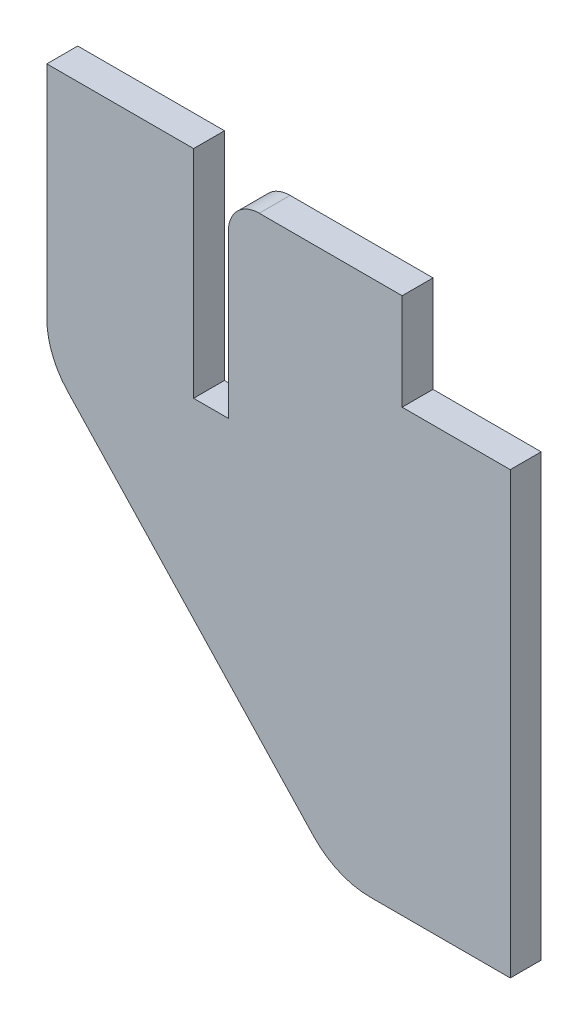
ISO-10303-21;
HEADER;
FILE_DESCRIPTION(('STEP AP214'),'2;1');
FILE_NAME('part.step','',(''),(''),'','','');
FILE_SCHEMA(('AUTOMOTIVE_DESIGN { 1 0 10303 214 1 1 1 1 }'));
ENDSEC;
DATA;
#1=APPLICATION_CONTEXT('core data for automotive mechanical design processes');
#2=APPLICATION_PROTOCOL_DEFINITION('international standard','automotive_design',2000,#1);
#3=PRODUCT_CONTEXT('',#1,'mechanical');
#4=PRODUCT('Part','Part','',(#3));
#5=PRODUCT_RELATED_PRODUCT_CATEGORY('part','',(#4));
#6=PRODUCT_DEFINITION_FORMATION('','',#4);
#7=PRODUCT_DEFINITION_CONTEXT('part definition',#1,'design');
#8=PRODUCT_DEFINITION('design','',#6,#7);
#9=PRODUCT_DEFINITION_SHAPE('','',#8);
#10=(LENGTH_UNIT() NAMED_UNIT(*) SI_UNIT(.MILLI.,.METRE.));
#11=(NAMED_UNIT(*) PLANE_ANGLE_UNIT() SI_UNIT($,.RADIAN.));
#12=(NAMED_UNIT(*) SI_UNIT($,.STERADIAN.) SOLID_ANGLE_UNIT());
#13=UNCERTAINTY_MEASURE_WITH_UNIT(LENGTH_MEASURE(1.E-05),#10,'distance_accuracy_value','');
#14=(GEOMETRIC_REPRESENTATION_CONTEXT(3) GLOBAL_UNCERTAINTY_ASSIGNED_CONTEXT((#13)) GLOBAL_UNIT_ASSIGNED_CONTEXT((#10,
#11,#12)) REPRESENTATION_CONTEXT('',''));
#15=CARTESIAN_POINT('',(0.,0.,0.));
#16=DIRECTION('',(0.,0.,1.));
#17=DIRECTION('',(1.,0.,0.));
#18=AXIS2_PLACEMENT_3D('',#15,#16,#17);
#19=CARTESIAN_POINT('',(0.,0.,8.));
#20=DIRECTION('',(0.,1.,0.));
#21=DIRECTION('',(-1.,0.,0.));
#22=AXIS2_PLACEMENT_3D('',#19,#20,#21);
#23=PLANE('',#22);
#24=DIRECTION('',(1.,0.,0.));
#25=VECTOR('',#24,1.);
#26=CARTESIAN_POINT('',(0.,0.,8.));
#27=LINE('',#26,#25);
#28=CARTESIAN_POINT('',(-36.3353597506733,0.,8.));
#29=VERTEX_POINT('',#28);
#30=CARTESIAN_POINT('',(0.,0.,8.));
#31=VERTEX_POINT('',#30);
#32=EDGE_CURVE('E138',#29,#31,#27,.T.);
#33=ORIENTED_EDGE('',*,*,#32,.F.);
#34=DIRECTION('',(0.,0.,-1.));
#35=VECTOR('',#34,1.);
#36=CARTESIAN_POINT('',(-36.3353597506734,0.,8.));
#37=LINE('',#36,#35);
#38=CARTESIAN_POINT('',(-36.3353597506733,0.,0.));
#39=VERTEX_POINT('',#38);
#40=EDGE_CURVE('E162',#29,#39,#37,.T.);
#41=ORIENTED_EDGE('',*,*,#40,.T.);
#42=DIRECTION('',(1.,0.,0.));
#43=VECTOR('',#42,1.);
#44=CARTESIAN_POINT('',(0.,0.,0.));
#45=LINE('',#44,#43);
#46=CARTESIAN_POINT('',(0.,0.,0.));
#47=VERTEX_POINT('',#46);
#48=EDGE_CURVE('E160',#39,#47,#45,.T.);
#49=ORIENTED_EDGE('',*,*,#48,.T.);
#50=DIRECTION('',(0.,0.,-1.));
#51=VECTOR('',#50,1.);
#52=CARTESIAN_POINT('',(0.,0.,8.));
#53=LINE('',#52,#51);
#54=EDGE_CURVE('E153',#31,#47,#53,.T.);
#55=ORIENTED_EDGE('',*,*,#54,.F.);
#56=EDGE_LOOP('',(#33,#41,#49,#55));
#57=FACE_BOUND('',#56,.T.);
#58=ADVANCED_FACE('F36',(#57),#23,.F.);
#59=CARTESIAN_POINT('',(0.,0.,8.));
#60=DIRECTION('',(-1.,0.,0.));
#61=DIRECTION('',(0.,0.,1.));
#62=AXIS2_PLACEMENT_3D('',#59,#60,#61);
#63=PLANE('',#62);
#64=DIRECTION('',(0.,1.,0.));
#65=VECTOR('',#64,1.);
#66=CARTESIAN_POINT('',(0.,0.,0.));
#67=LINE('',#66,#65);
#68=CARTESIAN_POINT('',(0.,114.,0.));
#69=VERTEX_POINT('',#68);
#70=EDGE_CURVE('E238',#47,#69,#67,.T.);
#71=ORIENTED_EDGE('',*,*,#70,.T.);
#72=DIRECTION('',(0.,0.,-1.));
#73=VECTOR('',#72,1.);
#74=CARTESIAN_POINT('',(0.,114.,8.));
#75=LINE('',#74,#73);
#76=CARTESIAN_POINT('',(0.,114.,8.));
#77=VERTEX_POINT('',#76);
#78=EDGE_CURVE('E155',#77,#69,#75,.T.);
#79=ORIENTED_EDGE('',*,*,#78,.F.);
#80=DIRECTION('',(0.,1.,0.));
#81=VECTOR('',#80,1.);
#82=CARTESIAN_POINT('',(0.,0.,8.));
#83=LINE('',#82,#81);
#84=EDGE_CURVE('E141',#31,#77,#83,.T.);
#85=ORIENTED_EDGE('',*,*,#84,.F.);
#86=ORIENTED_EDGE('',*,*,#54,.T.);
#87=EDGE_LOOP('',(#71,#79,#85,#86));
#88=FACE_BOUND('',#87,.T.);
#89=ADVANCED_FACE('F152',(#88),#63,.F.);
#90=CARTESIAN_POINT('',(-28.,114.,8.));
#91=DIRECTION('',(0.,-1.,0.));
#92=DIRECTION('',(0.,0.,-1.));
#93=AXIS2_PLACEMENT_3D('',#90,#91,#92);
#94=PLANE('',#93);
#95=DIRECTION('',(-1.,0.,0.));
#96=VECTOR('',#95,1.);
#97=CARTESIAN_POINT('',(-28.,114.,0.));
#98=LINE('',#97,#96);
#99=CARTESIAN_POINT('',(-28.,114.,0.));
#100=VERTEX_POINT('',#99);
#101=EDGE_CURVE('E232',#69,#100,#98,.T.);
#102=ORIENTED_EDGE('',*,*,#101,.T.);
#103=DIRECTION('',(0.,0.,-1.));
#104=VECTOR('',#103,1.);
#105=CARTESIAN_POINT('',(-28.,114.,8.));
#106=LINE('',#105,#104);
#107=CARTESIAN_POINT('',(-28.,114.,8.));
#108=VERTEX_POINT('',#107);
#109=EDGE_CURVE('E166',#108,#100,#106,.T.);
#110=ORIENTED_EDGE('',*,*,#109,.F.);
#111=DIRECTION('',(-1.,0.,0.));
#112=VECTOR('',#111,1.);
#113=CARTESIAN_POINT('',(-28.,114.,8.));
#114=LINE('',#113,#112);
#115=EDGE_CURVE('E157',#77,#108,#114,.T.);
#116=ORIENTED_EDGE('',*,*,#115,.F.);
#117=ORIENTED_EDGE('',*,*,#78,.T.);
#118=EDGE_LOOP('',(#102,#110,#116,#117));
#119=FACE_BOUND('',#118,.T.);
#120=ADVANCED_FACE('F264',(#119),#94,.F.);
#121=CARTESIAN_POINT('',(-28.,139.,8.));
#122=DIRECTION('',(-1.,0.,0.));
#123=DIRECTION('',(0.,-1.,0.));
#124=AXIS2_PLACEMENT_3D('',#121,#122,#123);
#125=PLANE('',#124);
#126=DIRECTION('',(0.,1.,0.));
#127=VECTOR('',#126,1.);
#128=CARTESIAN_POINT('',(-28.,139.,0.));
#129=LINE('',#128,#127);
#130=CARTESIAN_POINT('',(-28.,139.,0.));
#131=VERTEX_POINT('',#130);
#132=EDGE_CURVE('E227',#100,#131,#129,.T.);
#133=ORIENTED_EDGE('',*,*,#132,.T.);
#134=DIRECTION('',(0.,0.,-1.));
#135=VECTOR('',#134,1.);
#136=CARTESIAN_POINT('',(-28.,139.,8.));
#137=LINE('',#136,#135);
#138=CARTESIAN_POINT('',(-28.,139.,8.));
#139=VERTEX_POINT('',#138);
#140=EDGE_CURVE('E218',#139,#131,#137,.T.);
#141=ORIENTED_EDGE('',*,*,#140,.F.);
#142=DIRECTION('',(0.,1.,0.));
#143=VECTOR('',#142,1.);
#144=CARTESIAN_POINT('',(-28.,139.,8.));
#145=LINE('',#144,#143);
#146=EDGE_CURVE('E228',#108,#139,#145,.T.);
#147=ORIENTED_EDGE('',*,*,#146,.F.);
#148=ORIENTED_EDGE('',*,*,#109,.T.);
#149=EDGE_LOOP('',(#133,#141,#147,#148));
#150=FACE_BOUND('',#149,.T.);
#151=ADVANCED_FACE('F225',(#150),#125,.F.);
#152=CARTESIAN_POINT('',(-65.,139.,8.));
#153=DIRECTION('',(0.,-1.,0.));
#154=DIRECTION('',(0.,0.,-1.));
#155=AXIS2_PLACEMENT_3D('',#152,#153,#154);
#156=PLANE('',#155);
#157=DIRECTION('',(-1.,0.,0.));
#158=VECTOR('',#157,1.);
#159=CARTESIAN_POINT('',(-65.,139.,0.));
#160=LINE('',#159,#158);
#161=CARTESIAN_POINT('',(-65.,139.,0.));
#162=VERTEX_POINT('',#161);
#163=EDGE_CURVE('E234',#131,#162,#160,.T.);
#164=ORIENTED_EDGE('',*,*,#163,.T.);
#165=DIRECTION('',(0.,0.,-1.));
#166=VECTOR('',#165,1.);
#167=CARTESIAN_POINT('',(-65.,139.,8.));
#168=LINE('',#167,#166);
#169=CARTESIAN_POINT('',(-65.,139.,8.));
#170=VERTEX_POINT('',#169);
#171=EDGE_CURVE('E215',#170,#162,#168,.T.);
#172=ORIENTED_EDGE('',*,*,#171,.F.);
#173=DIRECTION('',(-1.,0.,0.));
#174=VECTOR('',#173,1.);
#175=CARTESIAN_POINT('',(-65.,139.,8.));
#176=LINE('',#175,#174);
#177=EDGE_CURVE('E266',#139,#170,#176,.T.);
#178=ORIENTED_EDGE('',*,*,#177,.F.);
#179=ORIENTED_EDGE('',*,*,#140,.T.);
#180=EDGE_LOOP('',(#164,#172,#178,#179));
#181=FACE_BOUND('',#180,.T.);
#182=ADVANCED_FACE('F288',(#181),#156,.F.);
#183=CARTESIAN_POINT('',(-65.,131.,8.));
#184=DIRECTION('',(0.,0.,-1.));
#185=DIRECTION('',(-1.,0.,0.));
#186=AXIS2_PLACEMENT_3D('',#183,#184,#185);
#187=CYLINDRICAL_SURFACE('',#186,8.00000000000001);
#188=CARTESIAN_POINT('',(-65.,131.,0.));
#189=DIRECTION('',(0.,0.,1.));
#190=DIRECTION('',(1.,0.,0.));
#191=AXIS2_PLACEMENT_3D('',#188,#189,#190);
#192=CIRCLE('',#191,8.00000000000001);
#193=CARTESIAN_POINT('',(-73.,131.,0.));
#194=VERTEX_POINT('',#193);
#195=EDGE_CURVE('E236',#162,#194,#192,.T.);
#196=ORIENTED_EDGE('',*,*,#195,.T.);
#197=DIRECTION('',(0.,0.,-1.));
#198=VECTOR('',#197,1.);
#199=CARTESIAN_POINT('',(-73.,131.,8.));
#200=LINE('',#199,#198);
#201=CARTESIAN_POINT('',(-73.,131.,8.));
#202=VERTEX_POINT('',#201);
#203=EDGE_CURVE('E212',#202,#194,#200,.T.);
#204=ORIENTED_EDGE('',*,*,#203,.F.);
#205=CARTESIAN_POINT('',(-65.,131.,8.));
#206=DIRECTION('',(0.,0.,1.));
#207=DIRECTION('',(1.,0.,0.));
#208=AXIS2_PLACEMENT_3D('',#205,#206,#207);
#209=CIRCLE('',#208,8.00000000000001);
#210=EDGE_CURVE('E270',#170,#202,#209,.T.);
#211=ORIENTED_EDGE('',*,*,#210,.F.);
#212=ORIENTED_EDGE('',*,*,#171,.T.);
#213=EDGE_LOOP('',(#196,#204,#211,#212));
#214=FACE_BOUND('',#213,.T.);
#215=ADVANCED_FACE('F284',(#214),#187,.T.);
#216=CARTESIAN_POINT('',(-73.,89.,8.));
#217=DIRECTION('',(1.,0.,0.));
#218=DIRECTION('',(0.,1.,0.));
#219=AXIS2_PLACEMENT_3D('',#216,#217,#218);
#220=PLANE('',#219);
#221=DIRECTION('',(0.,-1.,0.));
#222=VECTOR('',#221,1.);
#223=CARTESIAN_POINT('',(-73.,89.,0.));
#224=LINE('',#223,#222);
#225=CARTESIAN_POINT('',(-73.,89.,0.));
#226=VERTEX_POINT('',#225);
#227=EDGE_CURVE('E243',#194,#226,#224,.T.);
#228=ORIENTED_EDGE('',*,*,#227,.T.);
#229=DIRECTION('',(0.,0.,-1.));
#230=VECTOR('',#229,1.);
#231=CARTESIAN_POINT('',(-73.,89.,8.));
#232=LINE('',#231,#230);
#233=CARTESIAN_POINT('',(-73.,89.,8.));
#234=VERTEX_POINT('',#233);
#235=EDGE_CURVE('E209',#234,#226,#232,.T.);
#236=ORIENTED_EDGE('',*,*,#235,.F.);
#237=DIRECTION('',(0.,-1.,0.));
#238=VECTOR('',#237,1.);
#239=CARTESIAN_POINT('',(-73.,89.,8.));
#240=LINE('',#239,#238);
#241=EDGE_CURVE('E272',#202,#234,#240,.T.);
#242=ORIENTED_EDGE('',*,*,#241,.F.);
#243=ORIENTED_EDGE('',*,*,#203,.T.);
#244=EDGE_LOOP('',(#228,#236,#242,#243));
#245=FACE_BOUND('',#244,.T.);
#246=ADVANCED_FACE('F280',(#245),#220,.F.);
#247=CARTESIAN_POINT('',(-82.,89.,8.));
#248=DIRECTION('',(0.,-1.,0.));
#249=DIRECTION('',(0.,0.,-1.));
#250=AXIS2_PLACEMENT_3D('',#247,#248,#249);
#251=PLANE('',#250);
#252=DIRECTION('',(-1.,0.,0.));
#253=VECTOR('',#252,1.);
#254=CARTESIAN_POINT('',(-82.,89.,0.));
#255=LINE('',#254,#253);
#256=CARTESIAN_POINT('',(-82.,89.,0.));
#257=VERTEX_POINT('',#256);
#258=EDGE_CURVE('E245',#226,#257,#255,.T.);
#259=ORIENTED_EDGE('',*,*,#258,.T.);
#260=DIRECTION('',(0.,0.,-1.));
#261=VECTOR('',#260,1.);
#262=CARTESIAN_POINT('',(-82.,89.,8.));
#263=LINE('',#262,#261);
#264=CARTESIAN_POINT('',(-82.,89.,8.));
#265=VERTEX_POINT('',#264);
#266=EDGE_CURVE('E206',#265,#257,#263,.T.);
#267=ORIENTED_EDGE('',*,*,#266,.F.);
#268=DIRECTION('',(-1.,0.,0.));
#269=VECTOR('',#268,1.);
#270=CARTESIAN_POINT('',(-82.,89.,8.));
#271=LINE('',#270,#269);
#272=EDGE_CURVE('E260',#234,#265,#271,.T.);
#273=ORIENTED_EDGE('',*,*,#272,.F.);
#274=ORIENTED_EDGE('',*,*,#235,.T.);
#275=EDGE_LOOP('',(#259,#267,#273,#274));
#276=FACE_BOUND('',#275,.T.);
#277=ADVANCED_FACE('F277',(#276),#251,.F.);
#278=CARTESIAN_POINT('',(-82.,145.,8.));
#279=DIRECTION('',(-1.,0.,0.));
#280=DIRECTION('',(0.,0.,1.));
#281=AXIS2_PLACEMENT_3D('',#278,#279,#280);
#282=PLANE('',#281);
#283=DIRECTION('',(0.,1.,0.));
#284=VECTOR('',#283,1.);
#285=CARTESIAN_POINT('',(-82.,145.,0.));
#286=LINE('',#285,#284);
#287=CARTESIAN_POINT('',(-82.,145.,0.));
#288=VERTEX_POINT('',#287);
#289=EDGE_CURVE('E198',#257,#288,#286,.T.);
#290=ORIENTED_EDGE('',*,*,#289,.T.);
#291=DIRECTION('',(0.,0.,-1.));
#292=VECTOR('',#291,1.);
#293=CARTESIAN_POINT('',(-82.,145.,8.));
#294=LINE('',#293,#292);
#295=CARTESIAN_POINT('',(-82.,145.,8.));
#296=VERTEX_POINT('',#295);
#297=EDGE_CURVE('E203',#296,#288,#294,.T.);
#298=ORIENTED_EDGE('',*,*,#297,.F.);
#299=DIRECTION('',(0.,1.,0.));
#300=VECTOR('',#299,1.);
#301=CARTESIAN_POINT('',(-82.,145.,8.));
#302=LINE('',#301,#300);
#303=EDGE_CURVE('E257',#265,#296,#302,.T.);
#304=ORIENTED_EDGE('',*,*,#303,.F.);
#305=ORIENTED_EDGE('',*,*,#266,.T.);
#306=EDGE_LOOP('',(#290,#298,#304,#305));
#307=FACE_BOUND('',#306,.T.);
#308=ADVANCED_FACE('F249',(#307),#282,.F.);
#309=CARTESIAN_POINT('',(-120.,145.,8.));
#310=DIRECTION('',(0.,-1.,0.));
#311=DIRECTION('',(0.,0.,-1.));
#312=AXIS2_PLACEMENT_3D('',#309,#310,#311);
#313=PLANE('',#312);
#314=DIRECTION('',(-1.,0.,0.));
#315=VECTOR('',#314,1.);
#316=CARTESIAN_POINT('',(-120.,145.,0.));
#317=LINE('',#316,#315);
#318=CARTESIAN_POINT('',(-120.,145.,0.));
#319=VERTEX_POINT('',#318);
#320=EDGE_CURVE('E195',#288,#319,#317,.T.);
#321=ORIENTED_EDGE('',*,*,#320,.T.);
#322=DIRECTION('',(0.,0.,-1.));
#323=VECTOR('',#322,1.);
#324=CARTESIAN_POINT('',(-120.,145.,8.));
#325=LINE('',#324,#323);
#326=CARTESIAN_POINT('',(-120.,145.,8.));
#327=VERTEX_POINT('',#326);
#328=EDGE_CURVE('E185',#327,#319,#325,.T.);
#329=ORIENTED_EDGE('',*,*,#328,.F.);
#330=DIRECTION('',(-1.,0.,0.));
#331=VECTOR('',#330,1.);
#332=CARTESIAN_POINT('',(-120.,145.,8.));
#333=LINE('',#332,#331);
#334=EDGE_CURVE('E256',#296,#327,#333,.T.);
#335=ORIENTED_EDGE('',*,*,#334,.F.);
#336=ORIENTED_EDGE('',*,*,#297,.T.);
#337=EDGE_LOOP('',(#321,#329,#335,#336));
#338=FACE_BOUND('',#337,.T.);
#339=ADVANCED_FACE('F255',(#338),#313,.F.);
#340=CARTESIAN_POINT('',(-120.,80.,8.));
#341=DIRECTION('',(1.,0.,0.));
#342=DIRECTION('',(0.,0.,-1.));
#343=AXIS2_PLACEMENT_3D('',#340,#341,#342);
#344=PLANE('',#343);
#345=DIRECTION('',(0.,-1.,0.));
#346=VECTOR('',#345,1.);
#347=CARTESIAN_POINT('',(-120.,80.,0.));
#348=LINE('',#347,#346);
#349=CARTESIAN_POINT('',(-120.,87.9089495992817,0.));
#350=VERTEX_POINT('',#349);
#351=EDGE_CURVE('E191',#319,#350,#348,.T.);
#352=ORIENTED_EDGE('',*,*,#351,.T.);
#353=DIRECTION('',(0.,0.,-1.));
#354=VECTOR('',#353,1.);
#355=CARTESIAN_POINT('',(-120.,87.9089495992817,8.));
#356=LINE('',#355,#354);
#357=CARTESIAN_POINT('',(-120.,87.9089495992817,8.));
#358=VERTEX_POINT('',#357);
#359=EDGE_CURVE('E11',#350,#358,#356,.F.);
#360=ORIENTED_EDGE('',*,*,#359,.T.);
#361=DIRECTION('',(0.,-1.,0.));
#362=VECTOR('',#361,1.);
#363=CARTESIAN_POINT('',(-120.,80.,8.));
#364=LINE('',#363,#362);
#365=EDGE_CURVE('E180',#327,#358,#364,.T.);
#366=ORIENTED_EDGE('',*,*,#365,.F.);
#367=ORIENTED_EDGE('',*,*,#328,.T.);
#368=EDGE_LOOP('',(#352,#360,#366,#367));
#369=FACE_BOUND('',#368,.T.);
#370=ADVANCED_FACE('F193',(#369),#344,.F.);
#371=CARTESIAN_POINT('',(-45.,0.,8.));
#372=DIRECTION('',(0.729537204140085,0.68394112888133,0.));
#373=DIRECTION('',(-0.68394112888133,0.729537204140085,0.));
#374=AXIS2_PLACEMENT_3D('',#371,#372,#373);
#375=PLANE('',#374);
#376=DIRECTION('',(0.68394112888133,-0.729537204140085,0.));
#377=VECTOR('',#376,1.);
#378=CARTESIAN_POINT('',(-45.,0.,0.));
#379=LINE('',#378,#377);
#380=CARTESIAN_POINT('',(-114.590744082802,74.2301270216551,0.));
#381=VERTEX_POINT('',#380);
#382=CARTESIAN_POINT('',(-50.9261038334751,6.3211774223734,0.));
#383=VERTEX_POINT('',#382);
#384=EDGE_CURVE('E148',#381,#383,#379,.T.);
#385=ORIENTED_EDGE('',*,*,#384,.T.);
#386=DIRECTION('',(0.,0.,-1.));
#387=VECTOR('',#386,1.);
#388=CARTESIAN_POINT('',(-50.9261038334751,6.3211774223734,8.));
#389=LINE('',#388,#387);
#390=CARTESIAN_POINT('',(-50.9261038334751,6.3211774223734,8.));
#391=VERTEX_POINT('',#390);
#392=EDGE_CURVE('E57',#383,#391,#389,.F.);
#393=ORIENTED_EDGE('',*,*,#392,.T.);
#394=DIRECTION('',(0.68394112888133,-0.729537204140085,0.));
#395=VECTOR('',#394,1.);
#396=CARTESIAN_POINT('',(-45.,0.,8.));
#397=LINE('',#396,#395);
#398=CARTESIAN_POINT('',(-114.590744082802,74.2301270216551,8.));
#399=VERTEX_POINT('',#398);
#400=EDGE_CURVE('E179',#399,#391,#397,.T.);
#401=ORIENTED_EDGE('',*,*,#400,.F.);
#402=DIRECTION('',(0.,0.,-1.));
#403=VECTOR('',#402,1.);
#404=CARTESIAN_POINT('',(-114.590744082802,74.2301270216551,8.));
#405=LINE('',#404,#403);
#406=EDGE_CURVE('E173',#399,#381,#405,.T.);
#407=ORIENTED_EDGE('',*,*,#406,.T.);
#408=EDGE_LOOP('',(#385,#393,#401,#407));
#409=FACE_BOUND('',#408,.T.);
#410=ADVANCED_FACE('F183',(#409),#375,.F.);
#411=CARTESIAN_POINT('',(-65.,131.,8.));
#412=DIRECTION('',(0.,0.,1.));
#413=DIRECTION('',(1.,0.,0.));
#414=AXIS2_PLACEMENT_3D('',#411,#412,#413);
#415=PLANE('',#414);
#416=ORIENTED_EDGE('',*,*,#400,.T.);
#417=CARTESIAN_POINT('',(-36.3353597506734,20.,8.));
#418=DIRECTION('',(0.,0.,1.));
#419=DIRECTION('',(1.,0.,0.));
#420=AXIS2_PLACEMENT_3D('',#417,#418,#419);
#421=CIRCLE('',#420,20.);
#422=EDGE_CURVE('E44',#391,#29,#421,.T.);
#423=ORIENTED_EDGE('',*,*,#422,.T.);
#424=ORIENTED_EDGE('',*,*,#32,.T.);
#425=ORIENTED_EDGE('',*,*,#84,.T.);
#426=ORIENTED_EDGE('',*,*,#115,.T.);
#427=ORIENTED_EDGE('',*,*,#146,.T.);
#428=ORIENTED_EDGE('',*,*,#177,.T.);
#429=ORIENTED_EDGE('',*,*,#210,.T.);
#430=ORIENTED_EDGE('',*,*,#241,.T.);
#431=ORIENTED_EDGE('',*,*,#272,.T.);
#432=ORIENTED_EDGE('',*,*,#303,.T.);
#433=ORIENTED_EDGE('',*,*,#334,.T.);
#434=ORIENTED_EDGE('',*,*,#365,.T.);
#435=CARTESIAN_POINT('',(-100.,87.9089495992817,8.));
#436=DIRECTION('',(0.,0.,1.));
#437=DIRECTION('',(1.,0.,0.));
#438=AXIS2_PLACEMENT_3D('',#435,#436,#437);
#439=CIRCLE('',#438,20.);
#440=EDGE_CURVE('E177',#358,#399,#439,.T.);
#441=ORIENTED_EDGE('',*,*,#440,.T.);
#442=EDGE_LOOP('',(#416,#423,#424,#425,#426,#427,#428,#429,#430,#431,#432,#433,#434,#441));
#443=FACE_BOUND('',#442,.T.);
#444=ADVANCED_FACE('F140',(#443),#415,.T.);
#445=CARTESIAN_POINT('',(-65.,131.,0.));
#446=DIRECTION('',(0.,0.,1.));
#447=DIRECTION('',(1.,0.,0.));
#448=AXIS2_PLACEMENT_3D('',#445,#446,#447);
#449=PLANE('',#448);
#450=ORIENTED_EDGE('',*,*,#48,.F.);
#451=CARTESIAN_POINT('',(-36.3353597506734,20.,0.));
#452=DIRECTION('',(0.,0.,1.));
#453=DIRECTION('',(1.,0.,0.));
#454=AXIS2_PLACEMENT_3D('',#451,#452,#453);
#455=CIRCLE('',#454,20.);
#456=EDGE_CURVE('E171',#39,#383,#455,.F.);
#457=ORIENTED_EDGE('',*,*,#456,.T.);
#458=ORIENTED_EDGE('',*,*,#384,.F.);
#459=CARTESIAN_POINT('',(-100.,87.9089495992817,0.));
#460=DIRECTION('',(0.,0.,1.));
#461=DIRECTION('',(1.,0.,0.));
#462=AXIS2_PLACEMENT_3D('',#459,#460,#461);
#463=CIRCLE('',#462,20.);
#464=EDGE_CURVE('E164',#381,#350,#463,.F.);
#465=ORIENTED_EDGE('',*,*,#464,.T.);
#466=ORIENTED_EDGE('',*,*,#351,.F.);
#467=ORIENTED_EDGE('',*,*,#320,.F.);
#468=ORIENTED_EDGE('',*,*,#289,.F.);
#469=ORIENTED_EDGE('',*,*,#258,.F.);
#470=ORIENTED_EDGE('',*,*,#227,.F.);
#471=ORIENTED_EDGE('',*,*,#195,.F.);
#472=ORIENTED_EDGE('',*,*,#163,.F.);
#473=ORIENTED_EDGE('',*,*,#132,.F.);
#474=ORIENTED_EDGE('',*,*,#101,.F.);
#475=ORIENTED_EDGE('',*,*,#70,.F.);
#476=EDGE_LOOP('',(#450,#457,#458,#465,#466,#467,#468,#469,#470,#471,#472,#473,#474,#475));
#477=FACE_BOUND('',#476,.T.);
#478=ADVANCED_FACE('F189',(#477),#449,.F.);
#479=CARTESIAN_POINT('',(-36.3353597506734,20.,8.));
#480=DIRECTION('',(0.,0.,-1.));
#481=DIRECTION('',(-1.,0.,0.));
#482=AXIS2_PLACEMENT_3D('',#479,#480,#481);
#483=CYLINDRICAL_SURFACE('',#482,20.);
#484=ORIENTED_EDGE('',*,*,#422,.F.);
#485=ORIENTED_EDGE('',*,*,#392,.F.);
#486=ORIENTED_EDGE('',*,*,#456,.F.);
#487=ORIENTED_EDGE('',*,*,#40,.F.);
#488=EDGE_LOOP('',(#484,#485,#486,#487));
#489=FACE_BOUND('',#488,.T.);
#490=ADVANCED_FACE('F304',(#489),#483,.T.);
#491=CARTESIAN_POINT('',(-100.,87.9089495992817,8.));
#492=DIRECTION('',(0.,0.,-1.));
#493=DIRECTION('',(-1.,0.,0.));
#494=AXIS2_PLACEMENT_3D('',#491,#492,#493);
#495=CYLINDRICAL_SURFACE('',#494,20.);
#496=ORIENTED_EDGE('',*,*,#440,.F.);
#497=ORIENTED_EDGE('',*,*,#359,.F.);
#498=ORIENTED_EDGE('',*,*,#464,.F.);
#499=ORIENTED_EDGE('',*,*,#406,.F.);
#500=EDGE_LOOP('',(#496,#497,#498,#499));
#501=FACE_BOUND('',#500,.T.);
#502=ADVANCED_FACE('F38',(#501),#495,.T.);
#503=CLOSED_SHELL('',(#58,#89,#120,#151,#182,#215,#246,#277,#308,#339,#370,#410,#444,#478,#490,#502));
#504=MANIFOLD_SOLID_BREP('B2',#503);
#505=ADVANCED_BREP_SHAPE_REPRESENTATION('',(#18,#504),#14);
#506=SHAPE_DEFINITION_REPRESENTATION(#9,#505);
ENDSEC;
END-ISO-10303-21;
